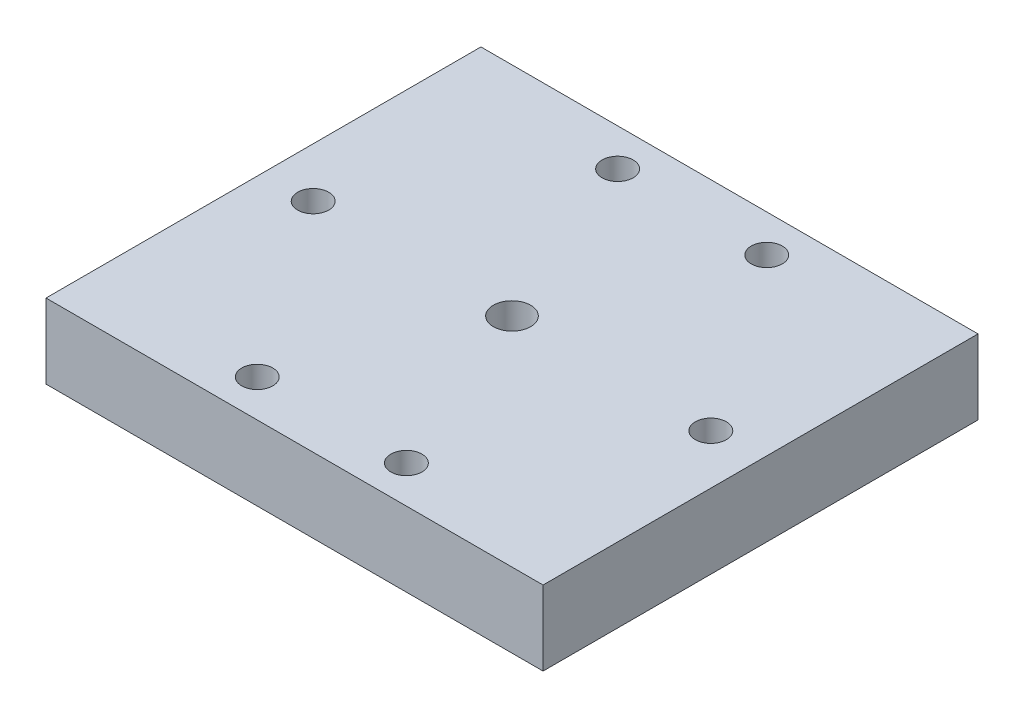
ISO-10303-21;
HEADER;
FILE_DESCRIPTION(('STEP AP214'),'2;1');
FILE_NAME('part.step','',(''),(''),'','','');
FILE_SCHEMA(('AUTOMOTIVE_DESIGN { 1 0 10303 214 1 1 1 1 }'));
ENDSEC;
DATA;
#1=APPLICATION_CONTEXT('core data for automotive mechanical design processes');
#2=APPLICATION_PROTOCOL_DEFINITION('international standard','automotive_design',2000,#1);
#3=PRODUCT_CONTEXT('',#1,'mechanical');
#4=PRODUCT('Part','Part','',(#3));
#5=PRODUCT_RELATED_PRODUCT_CATEGORY('part','',(#4));
#6=PRODUCT_DEFINITION_FORMATION('','',#4);
#7=PRODUCT_DEFINITION_CONTEXT('part definition',#1,'design');
#8=PRODUCT_DEFINITION('design','',#6,#7);
#9=PRODUCT_DEFINITION_SHAPE('','',#8);
#10=(LENGTH_UNIT() NAMED_UNIT(*) SI_UNIT(.MILLI.,.METRE.));
#11=(NAMED_UNIT(*) PLANE_ANGLE_UNIT() SI_UNIT($,.RADIAN.));
#12=(NAMED_UNIT(*) SI_UNIT($,.STERADIAN.) SOLID_ANGLE_UNIT());
#13=UNCERTAINTY_MEASURE_WITH_UNIT(LENGTH_MEASURE(1.E-05),#10,'distance_accuracy_value','');
#14=(GEOMETRIC_REPRESENTATION_CONTEXT(3) GLOBAL_UNCERTAINTY_ASSIGNED_CONTEXT((#13)) GLOBAL_UNIT_ASSIGNED_CONTEXT((#10,
#11,#12)) REPRESENTATION_CONTEXT('',''));
#15=CARTESIAN_POINT('',(0.,0.,0.));
#16=DIRECTION('',(0.,0.,1.));
#17=DIRECTION('',(1.,0.,0.));
#18=AXIS2_PLACEMENT_3D('',#15,#16,#17);
#19=CARTESIAN_POINT('',(0.,6.,0.));
#20=DIRECTION('',(0.,1.,0.));
#21=DIRECTION('',(0.,0.,1.));
#22=AXIS2_PLACEMENT_3D('',#19,#20,#21);
#23=PLANE('',#22);
#24=CARTESIAN_POINT('',(-6.,6.,-14.5));
#25=DIRECTION('',(0.,1.,0.));
#26=DIRECTION('',(0.,0.,-1.));
#27=AXIS2_PLACEMENT_3D('',#24,#25,#26);
#28=CIRCLE('',#27,1.25);
#29=CARTESIAN_POINT('',(-6.,6.,-15.75));
#30=VERTEX_POINT('',#29);
#31=EDGE_CURVE('E166',#30,#30,#28,.T.);
#32=ORIENTED_EDGE('',*,*,#31,.F.);
#33=EDGE_LOOP('',(#32));
#34=FACE_BOUND('',#33,.T.);
#35=CARTESIAN_POINT('',(-16.,6.,0.));
#36=DIRECTION('',(0.,1.,0.));
#37=DIRECTION('',(0.,0.,1.));
#38=AXIS2_PLACEMENT_3D('',#35,#36,#37);
#39=CIRCLE('',#38,1.25);
#40=CARTESIAN_POINT('',(-16.,6.,1.25));
#41=VERTEX_POINT('',#40);
#42=EDGE_CURVE('E150',#41,#41,#39,.T.);
#43=ORIENTED_EDGE('',*,*,#42,.F.);
#44=EDGE_LOOP('',(#43));
#45=FACE_BOUND('',#44,.T.);
#46=CARTESIAN_POINT('',(6.,6.,14.5));
#47=DIRECTION('',(0.,1.,0.));
#48=DIRECTION('',(0.,0.,1.));
#49=AXIS2_PLACEMENT_3D('',#46,#47,#48);
#50=CIRCLE('',#49,1.25);
#51=CARTESIAN_POINT('',(6.,6.,15.75));
#52=VERTEX_POINT('',#51);
#53=EDGE_CURVE('E134',#52,#52,#50,.T.);
#54=ORIENTED_EDGE('',*,*,#53,.F.);
#55=EDGE_LOOP('',(#54));
#56=FACE_BOUND('',#55,.T.);
#57=DIRECTION('',(0.,0.,-1.));
#58=VECTOR('',#57,1.);
#59=CARTESIAN_POINT('',(20.,6.,-17.5));
#60=LINE('',#59,#58);
#61=CARTESIAN_POINT('',(20.,6.,17.5));
#62=VERTEX_POINT('',#61);
#63=CARTESIAN_POINT('',(20.,6.,-17.5));
#64=VERTEX_POINT('',#63);
#65=EDGE_CURVE('E92',#62,#64,#60,.T.);
#66=ORIENTED_EDGE('',*,*,#65,.T.);
#67=DIRECTION('',(-1.,0.,0.));
#68=VECTOR('',#67,1.);
#69=CARTESIAN_POINT('',(-20.,6.,-17.5));
#70=LINE('',#69,#68);
#71=CARTESIAN_POINT('',(-20.,6.,-17.5));
#72=VERTEX_POINT('',#71);
#73=EDGE_CURVE('E87',#64,#72,#70,.T.);
#74=ORIENTED_EDGE('',*,*,#73,.T.);
#75=DIRECTION('',(0.,0.,1.));
#76=VECTOR('',#75,1.);
#77=CARTESIAN_POINT('',(-20.,6.,-17.5));
#78=LINE('',#77,#76);
#79=CARTESIAN_POINT('',(-20.,6.,17.5));
#80=VERTEX_POINT('',#79);
#81=EDGE_CURVE('E90',#72,#80,#78,.T.);
#82=ORIENTED_EDGE('',*,*,#81,.T.);
#83=DIRECTION('',(1.,0.,0.));
#84=VECTOR('',#83,1.);
#85=CARTESIAN_POINT('',(-20.,6.,17.5));
#86=LINE('',#85,#84);
#87=EDGE_CURVE('E57',#80,#62,#86,.T.);
#88=ORIENTED_EDGE('',*,*,#87,.T.);
#89=EDGE_LOOP('',(#66,#74,#82,#88));
#90=FACE_BOUND('',#89,.T.);
#91=CARTESIAN_POINT('',(16.,6.,0.));
#92=DIRECTION('',(0.,1.,0.));
#93=DIRECTION('',(0.,0.,1.));
#94=AXIS2_PLACEMENT_3D('',#91,#92,#93);
#95=CIRCLE('',#94,1.25);
#96=CARTESIAN_POINT('',(16.,6.,1.25));
#97=VERTEX_POINT('',#96);
#98=EDGE_CURVE('E112',#97,#97,#95,.T.);
#99=ORIENTED_EDGE('',*,*,#98,.F.);
#100=EDGE_LOOP('',(#99));
#101=FACE_BOUND('',#100,.T.);
#102=CARTESIAN_POINT('',(-6.,6.,14.5));
#103=DIRECTION('',(0.,1.,0.));
#104=DIRECTION('',(0.,0.,1.));
#105=AXIS2_PLACEMENT_3D('',#102,#103,#104);
#106=CIRCLE('',#105,1.25);
#107=CARTESIAN_POINT('',(-6.,6.,15.75));
#108=VERTEX_POINT('',#107);
#109=EDGE_CURVE('E142',#108,#108,#106,.T.);
#110=ORIENTED_EDGE('',*,*,#109,.F.);
#111=EDGE_LOOP('',(#110));
#112=FACE_BOUND('',#111,.T.);
#113=CARTESIAN_POINT('',(6.,6.,-14.5));
#114=DIRECTION('',(0.,1.,0.));
#115=DIRECTION('',(0.,0.,-1.));
#116=AXIS2_PLACEMENT_3D('',#113,#114,#115);
#117=CIRCLE('',#116,1.25);
#118=CARTESIAN_POINT('',(6.,6.,-15.75));
#119=VERTEX_POINT('',#118);
#120=EDGE_CURVE('E158',#119,#119,#117,.T.);
#121=ORIENTED_EDGE('',*,*,#120,.F.);
#122=EDGE_LOOP('',(#121));
#123=FACE_BOUND('',#122,.T.);
#124=CARTESIAN_POINT('',(0.,6.,0.));
#125=DIRECTION('',(0.,1.,0.));
#126=DIRECTION('',(0.,0.,1.));
#127=AXIS2_PLACEMENT_3D('',#124,#125,#126);
#128=CIRCLE('',#127,1.5);
#129=CARTESIAN_POINT('',(0.,6.,1.49999999999999));
#130=VERTEX_POINT('',#129);
#131=EDGE_CURVE('E174',#130,#130,#128,.T.);
#132=ORIENTED_EDGE('',*,*,#131,.F.);
#133=EDGE_LOOP('',(#132));
#134=FACE_BOUND('',#133,.T.);
#135=ADVANCED_FACE('F39',(#34,#45,#56,#90,#101,#112,#123,#134),#23,.T.);
#136=CARTESIAN_POINT('',(0.,0.,0.));
#137=DIRECTION('',(0.,1.,0.));
#138=DIRECTION('',(0.,0.,1.));
#139=AXIS2_PLACEMENT_3D('',#136,#137,#138);
#140=PLANE('',#139);
#141=DIRECTION('',(0.,0.,-1.));
#142=VECTOR('',#141,1.);
#143=CARTESIAN_POINT('',(20.,0.,-17.5));
#144=LINE('',#143,#142);
#145=CARTESIAN_POINT('',(20.,0.,17.5));
#146=VERTEX_POINT('',#145);
#147=CARTESIAN_POINT('',(20.,0.,-17.5));
#148=VERTEX_POINT('',#147);
#149=EDGE_CURVE('E108',#146,#148,#144,.T.);
#150=ORIENTED_EDGE('',*,*,#149,.F.);
#151=DIRECTION('',(1.,0.,0.));
#152=VECTOR('',#151,1.);
#153=CARTESIAN_POINT('',(-20.,0.,17.5));
#154=LINE('',#153,#152);
#155=CARTESIAN_POINT('',(-20.,0.,17.5));
#156=VERTEX_POINT('',#155);
#157=EDGE_CURVE('E80',#156,#146,#154,.T.);
#158=ORIENTED_EDGE('',*,*,#157,.F.);
#159=DIRECTION('',(0.,0.,1.));
#160=VECTOR('',#159,1.);
#161=CARTESIAN_POINT('',(-20.,0.,-17.5));
#162=LINE('',#161,#160);
#163=CARTESIAN_POINT('',(-20.,0.,-17.5));
#164=VERTEX_POINT('',#163);
#165=EDGE_CURVE('E74',#164,#156,#162,.T.);
#166=ORIENTED_EDGE('',*,*,#165,.F.);
#167=DIRECTION('',(-1.,0.,0.));
#168=VECTOR('',#167,1.);
#169=CARTESIAN_POINT('',(-20.,0.,-17.5));
#170=LINE('',#169,#168);
#171=EDGE_CURVE('E97',#148,#164,#170,.T.);
#172=ORIENTED_EDGE('',*,*,#171,.F.);
#173=EDGE_LOOP('',(#150,#158,#166,#172));
#174=FACE_BOUND('',#173,.T.);
#175=CARTESIAN_POINT('',(16.,0.,0.));
#176=DIRECTION('',(0.,1.,0.));
#177=DIRECTION('',(0.,0.,1.));
#178=AXIS2_PLACEMENT_3D('',#175,#176,#177);
#179=CIRCLE('',#178,1.25);
#180=CARTESIAN_POINT('',(16.,0.,1.25));
#181=VERTEX_POINT('',#180);
#182=EDGE_CURVE('E130',#181,#181,#179,.T.);
#183=ORIENTED_EDGE('',*,*,#182,.T.);
#184=EDGE_LOOP('',(#183));
#185=FACE_BOUND('',#184,.T.);
#186=CARTESIAN_POINT('',(6.,0.,14.5));
#187=DIRECTION('',(0.,1.,0.));
#188=DIRECTION('',(0.,0.,1.));
#189=AXIS2_PLACEMENT_3D('',#186,#187,#188);
#190=CIRCLE('',#189,1.25);
#191=CARTESIAN_POINT('',(6.,0.,15.75));
#192=VERTEX_POINT('',#191);
#193=EDGE_CURVE('E138',#192,#192,#190,.T.);
#194=ORIENTED_EDGE('',*,*,#193,.T.);
#195=EDGE_LOOP('',(#194));
#196=FACE_BOUND('',#195,.T.);
#197=CARTESIAN_POINT('',(-6.,0.,14.5));
#198=DIRECTION('',(0.,1.,0.));
#199=DIRECTION('',(0.,0.,1.));
#200=AXIS2_PLACEMENT_3D('',#197,#198,#199);
#201=CIRCLE('',#200,1.25);
#202=CARTESIAN_POINT('',(-6.,0.,15.75));
#203=VERTEX_POINT('',#202);
#204=EDGE_CURVE('E146',#203,#203,#201,.T.);
#205=ORIENTED_EDGE('',*,*,#204,.T.);
#206=EDGE_LOOP('',(#205));
#207=FACE_BOUND('',#206,.T.);
#208=CARTESIAN_POINT('',(-16.,0.,0.));
#209=DIRECTION('',(0.,1.,0.));
#210=DIRECTION('',(0.,0.,1.));
#211=AXIS2_PLACEMENT_3D('',#208,#209,#210);
#212=CIRCLE('',#211,1.25);
#213=CARTESIAN_POINT('',(-16.,0.,1.25));
#214=VERTEX_POINT('',#213);
#215=EDGE_CURVE('E154',#214,#214,#212,.T.);
#216=ORIENTED_EDGE('',*,*,#215,.T.);
#217=EDGE_LOOP('',(#216));
#218=FACE_BOUND('',#217,.T.);
#219=CARTESIAN_POINT('',(6.,0.,-14.5));
#220=DIRECTION('',(0.,1.,0.));
#221=DIRECTION('',(0.,0.,-1.));
#222=AXIS2_PLACEMENT_3D('',#219,#220,#221);
#223=CIRCLE('',#222,1.25);
#224=CARTESIAN_POINT('',(6.,0.,-15.75));
#225=VERTEX_POINT('',#224);
#226=EDGE_CURVE('E162',#225,#225,#223,.T.);
#227=ORIENTED_EDGE('',*,*,#226,.T.);
#228=EDGE_LOOP('',(#227));
#229=FACE_BOUND('',#228,.T.);
#230=CARTESIAN_POINT('',(-6.,0.,-14.5));
#231=DIRECTION('',(0.,1.,0.));
#232=DIRECTION('',(0.,0.,-1.));
#233=AXIS2_PLACEMENT_3D('',#230,#231,#232);
#234=CIRCLE('',#233,1.25);
#235=CARTESIAN_POINT('',(-6.,0.,-15.75));
#236=VERTEX_POINT('',#235);
#237=EDGE_CURVE('E170',#236,#236,#234,.T.);
#238=ORIENTED_EDGE('',*,*,#237,.T.);
#239=EDGE_LOOP('',(#238));
#240=FACE_BOUND('',#239,.T.);
#241=CARTESIAN_POINT('',(0.,0.,0.));
#242=DIRECTION('',(0.,1.,0.));
#243=DIRECTION('',(0.,0.,1.));
#244=AXIS2_PLACEMENT_3D('',#241,#242,#243);
#245=CIRCLE('',#244,1.5);
#246=CARTESIAN_POINT('',(0.,0.,1.49999999999999));
#247=VERTEX_POINT('',#246);
#248=EDGE_CURVE('E178',#247,#247,#245,.T.);
#249=ORIENTED_EDGE('',*,*,#248,.T.);
#250=EDGE_LOOP('',(#249));
#251=FACE_BOUND('',#250,.T.);
#252=ADVANCED_FACE('F125',(#174,#185,#196,#207,#218,#229,#240,#251),#140,.F.);
#253=CARTESIAN_POINT('',(20.,6.,-17.5));
#254=DIRECTION('',(-1.,0.,0.));
#255=DIRECTION('',(0.,0.,1.));
#256=AXIS2_PLACEMENT_3D('',#253,#254,#255);
#257=PLANE('',#256);
#258=ORIENTED_EDGE('',*,*,#149,.T.);
#259=DIRECTION('',(0.,-1.,0.));
#260=VECTOR('',#259,1.);
#261=CARTESIAN_POINT('',(20.,6.,-17.5));
#262=LINE('',#261,#260);
#263=EDGE_CURVE('E11',#64,#148,#262,.T.);
#264=ORIENTED_EDGE('',*,*,#263,.F.);
#265=ORIENTED_EDGE('',*,*,#65,.F.);
#266=DIRECTION('',(0.,-1.,0.));
#267=VECTOR('',#266,1.);
#268=CARTESIAN_POINT('',(20.,6.,17.5));
#269=LINE('',#268,#267);
#270=EDGE_CURVE('E104',#62,#146,#269,.T.);
#271=ORIENTED_EDGE('',*,*,#270,.T.);
#272=EDGE_LOOP('',(#258,#264,#265,#271));
#273=FACE_BOUND('',#272,.T.);
#274=ADVANCED_FACE('F41',(#273),#257,.F.);
#275=CARTESIAN_POINT('',(-20.,6.,-17.5));
#276=DIRECTION('',(0.,0.,1.));
#277=DIRECTION('',(1.,0.,0.));
#278=AXIS2_PLACEMENT_3D('',#275,#276,#277);
#279=PLANE('',#278);
#280=ORIENTED_EDGE('',*,*,#171,.T.);
#281=DIRECTION('',(0.,-1.,0.));
#282=VECTOR('',#281,1.);
#283=CARTESIAN_POINT('',(-20.,6.,-17.5));
#284=LINE('',#283,#282);
#285=EDGE_CURVE('E49',#72,#164,#284,.T.);
#286=ORIENTED_EDGE('',*,*,#285,.F.);
#287=ORIENTED_EDGE('',*,*,#73,.F.);
#288=ORIENTED_EDGE('',*,*,#263,.T.);
#289=EDGE_LOOP('',(#280,#286,#287,#288));
#290=FACE_BOUND('',#289,.T.);
#291=ADVANCED_FACE('F96',(#290),#279,.F.);
#292=CARTESIAN_POINT('',(-20.,6.,-17.5));
#293=DIRECTION('',(1.,0.,0.));
#294=DIRECTION('',(0.,0.,-1.));
#295=AXIS2_PLACEMENT_3D('',#292,#293,#294);
#296=PLANE('',#295);
#297=ORIENTED_EDGE('',*,*,#165,.T.);
#298=DIRECTION('',(0.,-1.,0.));
#299=VECTOR('',#298,1.);
#300=CARTESIAN_POINT('',(-20.,6.,17.5));
#301=LINE('',#300,#299);
#302=EDGE_CURVE('E99',#80,#156,#301,.T.);
#303=ORIENTED_EDGE('',*,*,#302,.F.);
#304=ORIENTED_EDGE('',*,*,#81,.F.);
#305=ORIENTED_EDGE('',*,*,#285,.T.);
#306=EDGE_LOOP('',(#297,#303,#304,#305));
#307=FACE_BOUND('',#306,.T.);
#308=ADVANCED_FACE('F100',(#307),#296,.F.);
#309=CARTESIAN_POINT('',(-20.,6.,17.5));
#310=DIRECTION('',(0.,0.,-1.));
#311=DIRECTION('',(-1.,0.,0.));
#312=AXIS2_PLACEMENT_3D('',#309,#310,#311);
#313=PLANE('',#312);
#314=ORIENTED_EDGE('',*,*,#157,.T.);
#315=ORIENTED_EDGE('',*,*,#270,.F.);
#316=ORIENTED_EDGE('',*,*,#87,.F.);
#317=ORIENTED_EDGE('',*,*,#302,.T.);
#318=EDGE_LOOP('',(#314,#315,#316,#317));
#319=FACE_BOUND('',#318,.T.);
#320=ADVANCED_FACE('F122',(#319),#313,.F.);
#321=CARTESIAN_POINT('',(16.,6.,0.));
#322=DIRECTION('',(0.,-1.,0.));
#323=DIRECTION('',(0.,0.,-1.));
#324=AXIS2_PLACEMENT_3D('',#321,#322,#323);
#325=CYLINDRICAL_SURFACE('',#324,1.25);
#326=ORIENTED_EDGE('',*,*,#98,.T.);
#327=EDGE_LOOP('',(#326));
#328=FACE_BOUND('',#327,.T.);
#329=ORIENTED_EDGE('',*,*,#182,.F.);
#330=EDGE_LOOP('',(#329));
#331=FACE_BOUND('',#330,.T.);
#332=ADVANCED_FACE('F199',(#328,#331),#325,.F.);
#333=CARTESIAN_POINT('',(6.,6.,14.5));
#334=DIRECTION('',(0.,-1.,0.));
#335=DIRECTION('',(0.,0.,-1.));
#336=AXIS2_PLACEMENT_3D('',#333,#334,#335);
#337=CYLINDRICAL_SURFACE('',#336,1.25);
#338=ORIENTED_EDGE('',*,*,#53,.T.);
#339=EDGE_LOOP('',(#338));
#340=FACE_BOUND('',#339,.T.);
#341=ORIENTED_EDGE('',*,*,#193,.F.);
#342=EDGE_LOOP('',(#341));
#343=FACE_BOUND('',#342,.T.);
#344=ADVANCED_FACE('F245',(#340,#343),#337,.F.);
#345=CARTESIAN_POINT('',(-6.,6.,14.5));
#346=DIRECTION('',(0.,-1.,0.));
#347=DIRECTION('',(0.,0.,-1.));
#348=AXIS2_PLACEMENT_3D('',#345,#346,#347);
#349=CYLINDRICAL_SURFACE('',#348,1.25);
#350=ORIENTED_EDGE('',*,*,#109,.T.);
#351=EDGE_LOOP('',(#350));
#352=FACE_BOUND('',#351,.T.);
#353=ORIENTED_EDGE('',*,*,#204,.F.);
#354=EDGE_LOOP('',(#353));
#355=FACE_BOUND('',#354,.T.);
#356=ADVANCED_FACE('F253',(#352,#355),#349,.F.);
#357=CARTESIAN_POINT('',(-16.,6.,0.));
#358=DIRECTION('',(0.,-1.,0.));
#359=DIRECTION('',(0.,0.,-1.));
#360=AXIS2_PLACEMENT_3D('',#357,#358,#359);
#361=CYLINDRICAL_SURFACE('',#360,1.25);
#362=ORIENTED_EDGE('',*,*,#42,.T.);
#363=EDGE_LOOP('',(#362));
#364=FACE_BOUND('',#363,.T.);
#365=ORIENTED_EDGE('',*,*,#215,.F.);
#366=EDGE_LOOP('',(#365));
#367=FACE_BOUND('',#366,.T.);
#368=ADVANCED_FACE('F261',(#364,#367),#361,.F.);
#369=CARTESIAN_POINT('',(6.,6.,-14.5));
#370=DIRECTION('',(0.,-1.,0.));
#371=DIRECTION('',(0.,0.,-1.));
#372=AXIS2_PLACEMENT_3D('',#369,#370,#371);
#373=CYLINDRICAL_SURFACE('',#372,1.25);
#374=ORIENTED_EDGE('',*,*,#120,.T.);
#375=EDGE_LOOP('',(#374));
#376=FACE_BOUND('',#375,.T.);
#377=ORIENTED_EDGE('',*,*,#226,.F.);
#378=EDGE_LOOP('',(#377));
#379=FACE_BOUND('',#378,.T.);
#380=ADVANCED_FACE('F270',(#376,#379),#373,.F.);
#381=CARTESIAN_POINT('',(-6.,6.,-14.5));
#382=DIRECTION('',(0.,-1.,0.));
#383=DIRECTION('',(0.,0.,-1.));
#384=AXIS2_PLACEMENT_3D('',#381,#382,#383);
#385=CYLINDRICAL_SURFACE('',#384,1.25);
#386=ORIENTED_EDGE('',*,*,#31,.T.);
#387=EDGE_LOOP('',(#386));
#388=FACE_BOUND('',#387,.T.);
#389=ORIENTED_EDGE('',*,*,#237,.F.);
#390=EDGE_LOOP('',(#389));
#391=FACE_BOUND('',#390,.T.);
#392=ADVANCED_FACE('F279',(#388,#391),#385,.F.);
#393=CARTESIAN_POINT('',(0.,6.,0.));
#394=DIRECTION('',(0.,-1.,0.));
#395=DIRECTION('',(0.,0.,-1.));
#396=AXIS2_PLACEMENT_3D('',#393,#394,#395);
#397=CYLINDRICAL_SURFACE('',#396,1.5);
#398=ORIENTED_EDGE('',*,*,#131,.T.);
#399=EDGE_LOOP('',(#398));
#400=FACE_BOUND('',#399,.T.);
#401=ORIENTED_EDGE('',*,*,#248,.F.);
#402=EDGE_LOOP('',(#401));
#403=FACE_BOUND('',#402,.T.);
#404=ADVANCED_FACE('F186',(#400,#403),#397,.F.);
#405=CLOSED_SHELL('',(#135,#252,#274,#291,#308,#320,#332,#344,#356,#368,#380,#392,#404));
#406=MANIFOLD_SOLID_BREP('B2',#405);
#407=ADVANCED_BREP_SHAPE_REPRESENTATION('',(#18,#406),#14);
#408=SHAPE_DEFINITION_REPRESENTATION(#9,#407);
ENDSEC;
END-ISO-10303-21;
